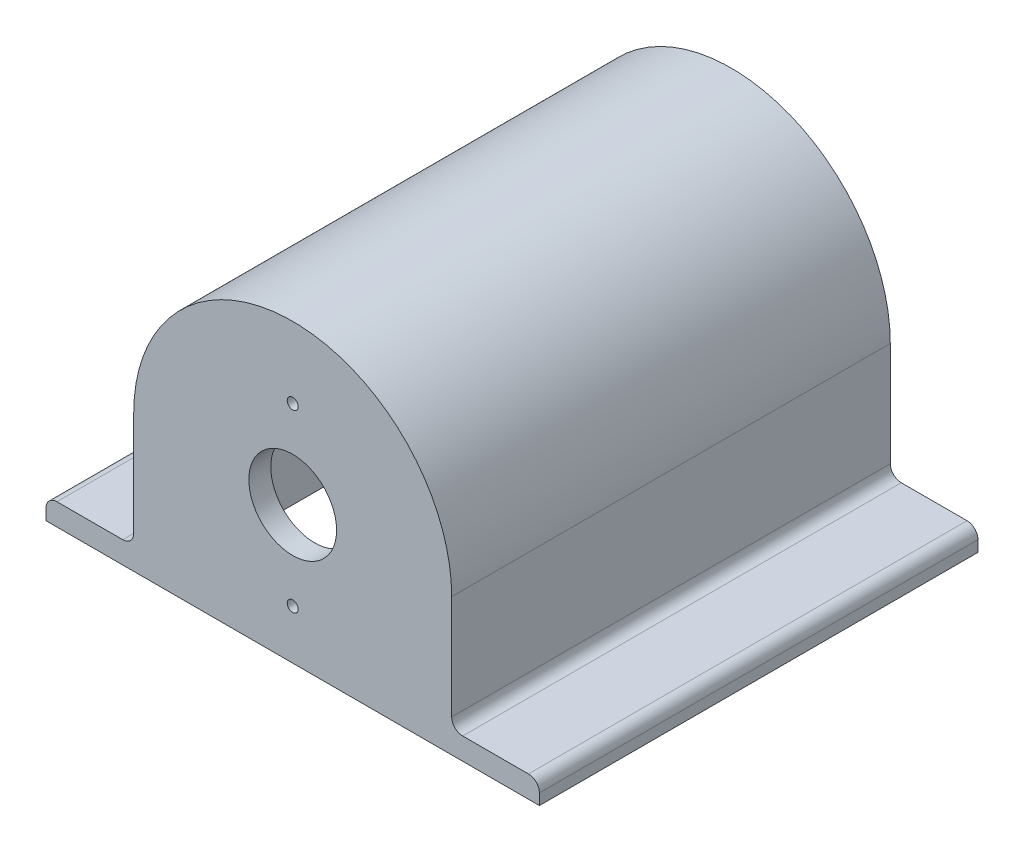
ISO-10303-21;
HEADER;
FILE_DESCRIPTION(('STEP AP214'),'2;1');
FILE_NAME('part.step','',(''),(''),'','','');
FILE_SCHEMA(('AUTOMOTIVE_DESIGN { 1 0 10303 214 1 1 1 1 }'));
ENDSEC;
DATA;
#1=APPLICATION_CONTEXT('core data for automotive mechanical design processes');
#2=APPLICATION_PROTOCOL_DEFINITION('international standard','automotive_design',2000,#1);
#3=PRODUCT_CONTEXT('',#1,'mechanical');
#4=PRODUCT('Part','Part','',(#3));
#5=PRODUCT_RELATED_PRODUCT_CATEGORY('part','',(#4));
#6=PRODUCT_DEFINITION_FORMATION('','',#4);
#7=PRODUCT_DEFINITION_CONTEXT('part definition',#1,'design');
#8=PRODUCT_DEFINITION('design','',#6,#7);
#9=PRODUCT_DEFINITION_SHAPE('','',#8);
#10=(LENGTH_UNIT() NAMED_UNIT(*) SI_UNIT(.MILLI.,.METRE.));
#11=(NAMED_UNIT(*) PLANE_ANGLE_UNIT() SI_UNIT($,.RADIAN.));
#12=(NAMED_UNIT(*) SI_UNIT($,.STERADIAN.) SOLID_ANGLE_UNIT());
#13=UNCERTAINTY_MEASURE_WITH_UNIT(LENGTH_MEASURE(1.E-05),#10,'distance_accuracy_value','');
#14=(GEOMETRIC_REPRESENTATION_CONTEXT(3) GLOBAL_UNCERTAINTY_ASSIGNED_CONTEXT((#13)) GLOBAL_UNIT_ASSIGNED_CONTEXT((#10,
#11,#12)) REPRESENTATION_CONTEXT('',''));
#15=CARTESIAN_POINT('',(0.,0.,0.));
#16=DIRECTION('',(0.,0.,1.));
#17=DIRECTION('',(1.,0.,0.));
#18=AXIS2_PLACEMENT_3D('',#15,#16,#17);
#19=CARTESIAN_POINT('',(0.,0.,40.));
#20=DIRECTION('',(0.,0.,-1.));
#21=DIRECTION('',(-1.,0.,0.));
#22=AXIS2_PLACEMENT_3D('',#19,#20,#21);
#23=CYLINDRICAL_SURFACE('',#22,12.5);
#24=DIRECTION('',(0.,0.,-1.));
#25=VECTOR('',#24,1.);
#26=CARTESIAN_POINT('',(12.5,0.,40.));
#27=LINE('',#26,#25);
#28=CARTESIAN_POINT('',(12.5,0.,38.));
#29=VERTEX_POINT('',#28);
#30=CARTESIAN_POINT('',(12.5,0.,0.));
#31=VERTEX_POINT('',#30);
#32=EDGE_CURVE('E177',#29,#31,#27,.T.);
#33=ORIENTED_EDGE('',*,*,#32,.F.);
#34=CARTESIAN_POINT('',(0.,0.,38.));
#35=DIRECTION('',(0.,0.,1.));
#36=DIRECTION('',(1.,0.,0.));
#37=AXIS2_PLACEMENT_3D('',#34,#35,#36);
#38=CIRCLE('',#37,12.5);
#39=CARTESIAN_POINT('',(-12.5,0.,38.));
#40=VERTEX_POINT('',#39);
#41=EDGE_CURVE('E163',#40,#29,#38,.F.);
#42=ORIENTED_EDGE('',*,*,#41,.F.);
#43=DIRECTION('',(0.,0.,-1.));
#44=VECTOR('',#43,1.);
#45=CARTESIAN_POINT('',(-12.5,0.,40.));
#46=LINE('',#45,#44);
#47=CARTESIAN_POINT('',(-12.5,0.,0.));
#48=VERTEX_POINT('',#47);
#49=EDGE_CURVE('E175',#40,#48,#46,.T.);
#50=ORIENTED_EDGE('',*,*,#49,.T.);
#51=CARTESIAN_POINT('',(0.,0.,0.));
#52=DIRECTION('',(0.,0.,1.));
#53=DIRECTION('',(1.,0.,0.));
#54=AXIS2_PLACEMENT_3D('',#51,#52,#53);
#55=CIRCLE('',#54,12.5);
#56=EDGE_CURVE('E348',#31,#48,#55,.T.);
#57=ORIENTED_EDGE('',*,*,#56,.F.);
#58=EDGE_LOOP('',(#33,#42,#50,#57));
#59=FACE_BOUND('',#58,.T.);
#60=ADVANCED_FACE('F42',(#59),#23,.F.);
#61=CARTESIAN_POINT('',(-12.5,-12.5,40.));
#62=DIRECTION('',(-1.,0.,0.));
#63=DIRECTION('',(0.,0.,1.));
#64=AXIS2_PLACEMENT_3D('',#61,#62,#63);
#65=PLANE('',#64);
#66=DIRECTION('',(0.,1.,0.));
#67=VECTOR('',#66,1.);
#68=CARTESIAN_POINT('',(-12.5,0.,38.));
#69=LINE('',#68,#67);
#70=CARTESIAN_POINT('',(-12.5,-12.5,38.));
#71=VERTEX_POINT('',#70);
#72=EDGE_CURVE('E158',#71,#40,#69,.T.);
#73=ORIENTED_EDGE('',*,*,#72,.F.);
#74=DIRECTION('',(0.,0.,1.));
#75=VECTOR('',#74,1.);
#76=CARTESIAN_POINT('',(-12.5,-12.5,40.));
#77=LINE('',#76,#75);
#78=CARTESIAN_POINT('',(-12.5,-12.5,0.));
#79=VERTEX_POINT('',#78);
#80=EDGE_CURVE('E329',#79,#71,#77,.T.);
#81=ORIENTED_EDGE('',*,*,#80,.F.);
#82=DIRECTION('',(0.,1.,0.));
#83=VECTOR('',#82,1.);
#84=CARTESIAN_POINT('',(-12.5,-12.5,0.));
#85=LINE('',#84,#83);
#86=EDGE_CURVE('E183',#79,#48,#85,.T.);
#87=ORIENTED_EDGE('',*,*,#86,.T.);
#88=ORIENTED_EDGE('',*,*,#49,.F.);
#89=EDGE_LOOP('',(#73,#81,#87,#88));
#90=FACE_BOUND('',#89,.T.);
#91=ADVANCED_FACE('F181',(#90),#65,.F.);
#92=CARTESIAN_POINT('',(12.5,-12.5,0.));
#93=DIRECTION('',(1.,0.,0.));
#94=DIRECTION('',(0.,0.,-1.));
#95=AXIS2_PLACEMENT_3D('',#92,#93,#94);
#96=PLANE('',#95);
#97=DIRECTION('',(0.,-1.,0.));
#98=VECTOR('',#97,1.);
#99=CARTESIAN_POINT('',(12.5,0.,38.));
#100=LINE('',#99,#98);
#101=CARTESIAN_POINT('',(12.5,-12.5,38.));
#102=VERTEX_POINT('',#101);
#103=EDGE_CURVE('E263',#29,#102,#100,.T.);
#104=ORIENTED_EDGE('',*,*,#103,.F.);
#105=ORIENTED_EDGE('',*,*,#32,.T.);
#106=DIRECTION('',(0.,1.,0.));
#107=VECTOR('',#106,1.);
#108=CARTESIAN_POINT('',(12.5,-12.5,0.));
#109=LINE('',#108,#107);
#110=CARTESIAN_POINT('',(12.5,-12.5,0.));
#111=VERTEX_POINT('',#110);
#112=EDGE_CURVE('E319',#111,#31,#109,.T.);
#113=ORIENTED_EDGE('',*,*,#112,.F.);
#114=DIRECTION('',(0.,0.,-1.));
#115=VECTOR('',#114,1.);
#116=CARTESIAN_POINT('',(12.5,-12.5,0.));
#117=LINE('',#116,#115);
#118=EDGE_CURVE('E307',#102,#111,#117,.T.);
#119=ORIENTED_EDGE('',*,*,#118,.F.);
#120=EDGE_LOOP('',(#104,#105,#113,#119));
#121=FACE_BOUND('',#120,.T.);
#122=ADVANCED_FACE('F360',(#121),#96,.F.);
#123=CARTESIAN_POINT('',(14.5,-12.5,0.));
#124=DIRECTION('',(-1.,0.,0.));
#125=DIRECTION('',(0.,0.,1.));
#126=AXIS2_PLACEMENT_3D('',#123,#124,#125);
#127=PLANE('',#126);
#128=DIRECTION('',(0.,1.,0.));
#129=VECTOR('',#128,1.);
#130=CARTESIAN_POINT('',(14.5,-12.5,40.));
#131=LINE('',#130,#129);
#132=CARTESIAN_POINT('',(14.5,-9.5,40.));
#133=VERTEX_POINT('',#132);
#134=CARTESIAN_POINT('',(14.5,0.,40.));
#135=VERTEX_POINT('',#134);
#136=EDGE_CURVE('E323',#133,#135,#131,.T.);
#137=ORIENTED_EDGE('',*,*,#136,.F.);
#138=DIRECTION('',(0.,0.,1.));
#139=VECTOR('',#138,1.);
#140=CARTESIAN_POINT('',(14.5,-9.5,0.));
#141=LINE('',#140,#139);
#142=CARTESIAN_POINT('',(14.5,-9.5,0.));
#143=VERTEX_POINT('',#142);
#144=EDGE_CURVE('E234',#133,#143,#141,.F.);
#145=ORIENTED_EDGE('',*,*,#144,.T.);
#146=DIRECTION('',(0.,1.,0.));
#147=VECTOR('',#146,1.);
#148=CARTESIAN_POINT('',(14.5,-12.5,0.));
#149=LINE('',#148,#147);
#150=CARTESIAN_POINT('',(14.5,0.,0.));
#151=VERTEX_POINT('',#150);
#152=EDGE_CURVE('E316',#143,#151,#149,.T.);
#153=ORIENTED_EDGE('',*,*,#152,.T.);
#154=DIRECTION('',(0.,0.,-1.));
#155=VECTOR('',#154,1.);
#156=CARTESIAN_POINT('',(14.5,0.,40.));
#157=LINE('',#156,#155);
#158=EDGE_CURVE('E191',#135,#151,#157,.T.);
#159=ORIENTED_EDGE('',*,*,#158,.F.);
#160=EDGE_LOOP('',(#137,#145,#153,#159));
#161=FACE_BOUND('',#160,.T.);
#162=ADVANCED_FACE('F395',(#161),#127,.F.);
#163=CARTESIAN_POINT('',(0.,0.,40.));
#164=DIRECTION('',(0.,0.,-1.));
#165=DIRECTION('',(-1.,0.,0.));
#166=AXIS2_PLACEMENT_3D('',#163,#164,#165);
#167=CYLINDRICAL_SURFACE('',#166,14.5);
#168=CARTESIAN_POINT('',(0.,0.,0.));
#169=DIRECTION('',(0.,0.,1.));
#170=DIRECTION('',(1.,0.,0.));
#171=AXIS2_PLACEMENT_3D('',#168,#169,#170);
#172=CIRCLE('',#171,14.5);
#173=CARTESIAN_POINT('',(-14.5,0.,0.));
#174=VERTEX_POINT('',#173);
#175=EDGE_CURVE('E344',#151,#174,#172,.T.);
#176=ORIENTED_EDGE('',*,*,#175,.T.);
#177=DIRECTION('',(0.,0.,-1.));
#178=VECTOR('',#177,1.);
#179=CARTESIAN_POINT('',(-14.5,0.,40.));
#180=LINE('',#179,#178);
#181=CARTESIAN_POINT('',(-14.5,0.,40.));
#182=VERTEX_POINT('',#181);
#183=EDGE_CURVE('E186',#182,#174,#180,.T.);
#184=ORIENTED_EDGE('',*,*,#183,.F.);
#185=CARTESIAN_POINT('',(0.,0.,40.));
#186=DIRECTION('',(0.,0.,1.));
#187=DIRECTION('',(1.,0.,0.));
#188=AXIS2_PLACEMENT_3D('',#185,#186,#187);
#189=CIRCLE('',#188,14.5);
#190=EDGE_CURVE('E193',#135,#182,#189,.T.);
#191=ORIENTED_EDGE('',*,*,#190,.F.);
#192=ORIENTED_EDGE('',*,*,#158,.T.);
#193=EDGE_LOOP('',(#176,#184,#191,#192));
#194=FACE_BOUND('',#193,.T.);
#195=ADVANCED_FACE('F391',(#194),#167,.T.);
#196=CARTESIAN_POINT('',(0.,0.,40.));
#197=DIRECTION('',(0.,0.,1.));
#198=DIRECTION('',(1.,0.,0.));
#199=AXIS2_PLACEMENT_3D('',#196,#197,#198);
#200=PLANE('',#199);
#201=CARTESIAN_POINT('',(0.,8.,40.));
#202=DIRECTION('',(0.,0.,1.));
#203=DIRECTION('',(1.,0.,0.));
#204=AXIS2_PLACEMENT_3D('',#201,#202,#203);
#205=CIRCLE('',#204,0.5);
#206=CARTESIAN_POINT('',(0.5,8.,40.));
#207=VERTEX_POINT('',#206);
#208=EDGE_CURVE('E246',#207,#207,#205,.T.);
#209=ORIENTED_EDGE('',*,*,#208,.F.);
#210=EDGE_LOOP('',(#209));
#211=FACE_BOUND('',#210,.T.);
#212=CARTESIAN_POINT('',(0.,-8.,40.));
#213=DIRECTION('',(0.,0.,1.));
#214=DIRECTION('',(1.,0.,0.));
#215=AXIS2_PLACEMENT_3D('',#212,#213,#214);
#216=CIRCLE('',#215,0.5);
#217=CARTESIAN_POINT('',(0.5,-8.,40.));
#218=VERTEX_POINT('',#217);
#219=EDGE_CURVE('E253',#218,#218,#216,.T.);
#220=ORIENTED_EDGE('',*,*,#219,.F.);
#221=EDGE_LOOP('',(#220));
#222=FACE_BOUND('',#221,.T.);
#223=DIRECTION('',(-1.,0.,0.));
#224=VECTOR('',#223,1.);
#225=CARTESIAN_POINT('',(-12.5,-10.5,40.));
#226=LINE('',#225,#224);
#227=CARTESIAN_POINT('',(-15.5,-10.5,40.));
#228=VERTEX_POINT('',#227);
#229=CARTESIAN_POINT('',(-21.5,-10.5,40.));
#230=VERTEX_POINT('',#229);
#231=EDGE_CURVE('E292',#228,#230,#226,.T.);
#232=ORIENTED_EDGE('',*,*,#231,.T.);
#233=CARTESIAN_POINT('',(-21.5,-11.5,40.));
#234=DIRECTION('',(0.,0.,1.));
#235=DIRECTION('',(1.,0.,0.));
#236=AXIS2_PLACEMENT_3D('',#233,#234,#235);
#237=CIRCLE('',#236,1.);
#238=CARTESIAN_POINT('',(-22.5,-11.5,40.));
#239=VERTEX_POINT('',#238);
#240=EDGE_CURVE('E218',#230,#239,#237,.T.);
#241=ORIENTED_EDGE('',*,*,#240,.T.);
#242=DIRECTION('',(0.,-1.,0.));
#243=VECTOR('',#242,1.);
#244=CARTESIAN_POINT('',(-22.5,-10.5,40.));
#245=LINE('',#244,#243);
#246=CARTESIAN_POINT('',(-22.5,-12.5,40.));
#247=VERTEX_POINT('',#246);
#248=EDGE_CURVE('E300',#239,#247,#245,.T.);
#249=ORIENTED_EDGE('',*,*,#248,.T.);
#250=DIRECTION('',(-1.,0.,0.));
#251=VECTOR('',#250,1.);
#252=CARTESIAN_POINT('',(-14.5,-12.5,40.));
#253=LINE('',#252,#251);
#254=CARTESIAN_POINT('',(22.5,-12.5,40.));
#255=VERTEX_POINT('',#254);
#256=EDGE_CURVE('E332',#255,#247,#253,.T.);
#257=ORIENTED_EDGE('',*,*,#256,.F.);
#258=DIRECTION('',(0.,-1.,0.));
#259=VECTOR('',#258,1.);
#260=CARTESIAN_POINT('',(22.5,-10.5,40.));
#261=LINE('',#260,#259);
#262=CARTESIAN_POINT('',(22.5,-11.5,40.));
#263=VERTEX_POINT('',#262);
#264=EDGE_CURVE('E286',#263,#255,#261,.T.);
#265=ORIENTED_EDGE('',*,*,#264,.F.);
#266=CARTESIAN_POINT('',(21.5,-11.5,40.));
#267=DIRECTION('',(0.,0.,1.));
#268=DIRECTION('',(1.,0.,0.));
#269=AXIS2_PLACEMENT_3D('',#266,#267,#268);
#270=CIRCLE('',#269,1.);
#271=CARTESIAN_POINT('',(21.5,-10.5,40.));
#272=VERTEX_POINT('',#271);
#273=EDGE_CURVE('E60',#263,#272,#270,.T.);
#274=ORIENTED_EDGE('',*,*,#273,.T.);
#275=DIRECTION('',(-1.,0.,0.));
#276=VECTOR('',#275,1.);
#277=CARTESIAN_POINT('',(12.5,-10.5,40.));
#278=LINE('',#277,#276);
#279=CARTESIAN_POINT('',(15.5,-10.5,40.));
#280=VERTEX_POINT('',#279);
#281=EDGE_CURVE('E278',#272,#280,#278,.T.);
#282=ORIENTED_EDGE('',*,*,#281,.T.);
#283=CARTESIAN_POINT('',(15.5,-9.5,40.));
#284=DIRECTION('',(0.,0.,1.));
#285=DIRECTION('',(1.,0.,0.));
#286=AXIS2_PLACEMENT_3D('',#283,#284,#285);
#287=CIRCLE('',#286,1.);
#288=EDGE_CURVE('E52',#280,#133,#287,.F.);
#289=ORIENTED_EDGE('',*,*,#288,.T.);
#290=ORIENTED_EDGE('',*,*,#136,.T.);
#291=ORIENTED_EDGE('',*,*,#190,.T.);
#292=DIRECTION('',(0.,1.,0.));
#293=VECTOR('',#292,1.);
#294=CARTESIAN_POINT('',(-14.5,-12.5,40.));
#295=LINE('',#294,#293);
#296=CARTESIAN_POINT('',(-14.5,-9.5,40.));
#297=VERTEX_POINT('',#296);
#298=EDGE_CURVE('E336',#297,#182,#295,.T.);
#299=ORIENTED_EDGE('',*,*,#298,.F.);
#300=CARTESIAN_POINT('',(-15.5,-9.5,40.));
#301=DIRECTION('',(0.,0.,1.));
#302=DIRECTION('',(1.,0.,0.));
#303=AXIS2_PLACEMENT_3D('',#300,#301,#302);
#304=CIRCLE('',#303,1.);
#305=EDGE_CURVE('E68',#297,#228,#304,.F.);
#306=ORIENTED_EDGE('',*,*,#305,.T.);
#307=EDGE_LOOP('',(#232,#241,#249,#257,#265,#274,#282,#289,#290,#291,#299,#306));
#308=FACE_BOUND('',#307,.T.);
#309=CARTESIAN_POINT('',(0.,0.,40.));
#310=DIRECTION('',(0.,0.,1.));
#311=DIRECTION('',(1.,0.,0.));
#312=AXIS2_PLACEMENT_3D('',#309,#310,#311);
#313=CIRCLE('',#312,4.);
#314=CARTESIAN_POINT('',(4.,0.,40.));
#315=VERTEX_POINT('',#314);
#316=EDGE_CURVE('E179',#315,#315,#313,.T.);
#317=ORIENTED_EDGE('',*,*,#316,.F.);
#318=EDGE_LOOP('',(#317));
#319=FACE_BOUND('',#318,.T.);
#320=ADVANCED_FACE('F378',(#211,#222,#308,#319),#200,.T.);
#321=CARTESIAN_POINT('',(0.,0.,0.));
#322=DIRECTION('',(0.,0.,1.));
#323=DIRECTION('',(1.,0.,0.));
#324=AXIS2_PLACEMENT_3D('',#321,#322,#323);
#325=PLANE('',#324);
#326=DIRECTION('',(0.,-1.,0.));
#327=VECTOR('',#326,1.);
#328=CARTESIAN_POINT('',(-22.5,-10.5,0.));
#329=LINE('',#328,#327);
#330=CARTESIAN_POINT('',(-22.5,-11.5,0.));
#331=VERTEX_POINT('',#330);
#332=CARTESIAN_POINT('',(-22.5,-12.5,0.));
#333=VERTEX_POINT('',#332);
#334=EDGE_CURVE('E304',#331,#333,#329,.T.);
#335=ORIENTED_EDGE('',*,*,#334,.F.);
#336=CARTESIAN_POINT('',(-21.5,-11.5,0.));
#337=DIRECTION('',(0.,0.,1.));
#338=DIRECTION('',(1.,0.,0.));
#339=AXIS2_PLACEMENT_3D('',#336,#337,#338);
#340=CIRCLE('',#339,1.);
#341=CARTESIAN_POINT('',(-21.5,-10.5,0.));
#342=VERTEX_POINT('',#341);
#343=EDGE_CURVE('E207',#331,#342,#340,.F.);
#344=ORIENTED_EDGE('',*,*,#343,.T.);
#345=DIRECTION('',(1.,0.,0.));
#346=VECTOR('',#345,1.);
#347=CARTESIAN_POINT('',(-12.5,-10.5,0.));
#348=LINE('',#347,#346);
#349=CARTESIAN_POINT('',(-15.5,-10.5,0.));
#350=VERTEX_POINT('',#349);
#351=EDGE_CURVE('E296',#342,#350,#348,.T.);
#352=ORIENTED_EDGE('',*,*,#351,.T.);
#353=CARTESIAN_POINT('',(-15.5,-9.5,0.));
#354=DIRECTION('',(0.,0.,1.));
#355=DIRECTION('',(1.,0.,0.));
#356=AXIS2_PLACEMENT_3D('',#353,#354,#355);
#357=CIRCLE('',#356,1.);
#358=CARTESIAN_POINT('',(-14.5,-9.5,0.));
#359=VERTEX_POINT('',#358);
#360=EDGE_CURVE('E239',#350,#359,#357,.T.);
#361=ORIENTED_EDGE('',*,*,#360,.T.);
#362=DIRECTION('',(0.,1.,0.));
#363=VECTOR('',#362,1.);
#364=CARTESIAN_POINT('',(-14.5,-12.5,0.));
#365=LINE('',#364,#363);
#366=EDGE_CURVE('E341',#359,#174,#365,.T.);
#367=ORIENTED_EDGE('',*,*,#366,.T.);
#368=ORIENTED_EDGE('',*,*,#175,.F.);
#369=ORIENTED_EDGE('',*,*,#152,.F.);
#370=CARTESIAN_POINT('',(15.5,-9.5,0.));
#371=DIRECTION('',(0.,0.,1.));
#372=DIRECTION('',(1.,0.,0.));
#373=AXIS2_PLACEMENT_3D('',#370,#371,#372);
#374=CIRCLE('',#373,1.);
#375=CARTESIAN_POINT('',(15.5,-10.5,0.));
#376=VERTEX_POINT('',#375);
#377=EDGE_CURVE('E11',#143,#376,#374,.T.);
#378=ORIENTED_EDGE('',*,*,#377,.T.);
#379=DIRECTION('',(1.,0.,0.));
#380=VECTOR('',#379,1.);
#381=CARTESIAN_POINT('',(12.5,-10.5,0.));
#382=LINE('',#381,#380);
#383=CARTESIAN_POINT('',(21.5,-10.5,0.));
#384=VERTEX_POINT('',#383);
#385=EDGE_CURVE('E274',#376,#384,#382,.T.);
#386=ORIENTED_EDGE('',*,*,#385,.T.);
#387=CARTESIAN_POINT('',(21.5,-11.5,0.));
#388=DIRECTION('',(0.,0.,1.));
#389=DIRECTION('',(1.,0.,0.));
#390=AXIS2_PLACEMENT_3D('',#387,#388,#389);
#391=CIRCLE('',#390,1.);
#392=CARTESIAN_POINT('',(22.5,-11.5,0.));
#393=VERTEX_POINT('',#392);
#394=EDGE_CURVE('E204',#384,#393,#391,.F.);
#395=ORIENTED_EDGE('',*,*,#394,.T.);
#396=DIRECTION('',(0.,-1.,0.));
#397=VECTOR('',#396,1.);
#398=CARTESIAN_POINT('',(22.5,-10.5,0.));
#399=LINE('',#398,#397);
#400=CARTESIAN_POINT('',(22.5,-12.5,0.));
#401=VERTEX_POINT('',#400);
#402=EDGE_CURVE('E282',#393,#401,#399,.T.);
#403=ORIENTED_EDGE('',*,*,#402,.T.);
#404=DIRECTION('',(1.,0.,0.));
#405=VECTOR('',#404,1.);
#406=CARTESIAN_POINT('',(14.5,-12.5,0.));
#407=LINE('',#406,#405);
#408=EDGE_CURVE('E312',#111,#401,#407,.T.);
#409=ORIENTED_EDGE('',*,*,#408,.F.);
#410=ORIENTED_EDGE('',*,*,#112,.T.);
#411=ORIENTED_EDGE('',*,*,#56,.T.);
#412=ORIENTED_EDGE('',*,*,#86,.F.);
#413=DIRECTION('',(1.,0.,0.));
#414=VECTOR('',#413,1.);
#415=CARTESIAN_POINT('',(-14.5,-12.5,0.));
#416=LINE('',#415,#414);
#417=EDGE_CURVE('E326',#333,#79,#416,.T.);
#418=ORIENTED_EDGE('',*,*,#417,.F.);
#419=EDGE_LOOP('',(#335,#344,#352,#361,#367,#368,#369,#378,#386,#395,#403,#409,#410,#411,#412,#418));
#420=FACE_BOUND('',#419,.T.);
#421=ADVANCED_FACE('F354',(#420),#325,.F.);
#422=CARTESIAN_POINT('',(-14.5,-12.5,40.));
#423=DIRECTION('',(1.,0.,0.));
#424=DIRECTION('',(0.,0.,-1.));
#425=AXIS2_PLACEMENT_3D('',#422,#423,#424);
#426=PLANE('',#425);
#427=ORIENTED_EDGE('',*,*,#366,.F.);
#428=DIRECTION('',(0.,0.,1.));
#429=VECTOR('',#428,1.);
#430=CARTESIAN_POINT('',(-14.5,-9.5,40.));
#431=LINE('',#430,#429);
#432=EDGE_CURVE('E221',#359,#297,#431,.T.);
#433=ORIENTED_EDGE('',*,*,#432,.T.);
#434=ORIENTED_EDGE('',*,*,#298,.T.);
#435=ORIENTED_EDGE('',*,*,#183,.T.);
#436=EDGE_LOOP('',(#427,#433,#434,#435));
#437=FACE_BOUND('',#436,.T.);
#438=ADVANCED_FACE('F385',(#437),#426,.F.);
#439=CARTESIAN_POINT('',(0.,-12.5,0.));
#440=DIRECTION('',(0.,-1.,0.));
#441=DIRECTION('',(0.,0.,-1.));
#442=AXIS2_PLACEMENT_3D('',#439,#440,#441);
#443=PLANE('',#442);
#444=ORIENTED_EDGE('',*,*,#256,.T.);
#445=DIRECTION('',(0.,0.,-1.));
#446=VECTOR('',#445,1.);
#447=CARTESIAN_POINT('',(-22.5,-12.5,40.));
#448=LINE('',#447,#446);
#449=EDGE_CURVE('E289',#247,#333,#448,.T.);
#450=ORIENTED_EDGE('',*,*,#449,.T.);
#451=ORIENTED_EDGE('',*,*,#417,.T.);
#452=ORIENTED_EDGE('',*,*,#80,.T.);
#453=DIRECTION('',(1.,0.,0.));
#454=VECTOR('',#453,1.);
#455=CARTESIAN_POINT('',(0.,-12.5,38.));
#456=LINE('',#455,#454);
#457=EDGE_CURVE('E165',#71,#102,#456,.T.);
#458=ORIENTED_EDGE('',*,*,#457,.T.);
#459=ORIENTED_EDGE('',*,*,#118,.T.);
#460=ORIENTED_EDGE('',*,*,#408,.T.);
#461=DIRECTION('',(0.,0.,1.));
#462=VECTOR('',#461,1.);
#463=CARTESIAN_POINT('',(22.5,-12.5,40.));
#464=LINE('',#463,#462);
#465=EDGE_CURVE('E270',#401,#255,#464,.T.);
#466=ORIENTED_EDGE('',*,*,#465,.T.);
#467=EDGE_LOOP('',(#444,#450,#451,#452,#458,#459,#460,#466));
#468=FACE_BOUND('',#467,.T.);
#469=ADVANCED_FACE('F362',(#468),#443,.T.);
#470=CARTESIAN_POINT('',(0.,-10.5,0.));
#471=DIRECTION('',(0.,1.,0.));
#472=DIRECTION('',(0.,0.,1.));
#473=AXIS2_PLACEMENT_3D('',#470,#471,#472);
#474=PLANE('',#473);
#475=ORIENTED_EDGE('',*,*,#351,.F.);
#476=DIRECTION('',(0.,0.,-1.));
#477=VECTOR('',#476,1.);
#478=CARTESIAN_POINT('',(-21.5,-10.5,0.));
#479=LINE('',#478,#477);
#480=EDGE_CURVE('E213',#342,#230,#479,.F.);
#481=ORIENTED_EDGE('',*,*,#480,.T.);
#482=ORIENTED_EDGE('',*,*,#231,.F.);
#483=DIRECTION('',(0.,0.,1.));
#484=VECTOR('',#483,1.);
#485=CARTESIAN_POINT('',(-15.5,-10.5,0.));
#486=LINE('',#485,#484);
#487=EDGE_CURVE('E210',#228,#350,#486,.F.);
#488=ORIENTED_EDGE('',*,*,#487,.T.);
#489=EDGE_LOOP('',(#475,#481,#482,#488));
#490=FACE_BOUND('',#489,.T.);
#491=ADVANCED_FACE('F376',(#490),#474,.T.);
#492=CARTESIAN_POINT('',(-22.5,-10.5,40.));
#493=DIRECTION('',(-1.,0.,0.));
#494=DIRECTION('',(0.,0.,1.));
#495=AXIS2_PLACEMENT_3D('',#492,#493,#494);
#496=PLANE('',#495);
#497=ORIENTED_EDGE('',*,*,#248,.F.);
#498=DIRECTION('',(0.,0.,-1.));
#499=VECTOR('',#498,1.);
#500=CARTESIAN_POINT('',(-22.5,-11.5,40.));
#501=LINE('',#500,#499);
#502=EDGE_CURVE('E200',#239,#331,#501,.T.);
#503=ORIENTED_EDGE('',*,*,#502,.T.);
#504=ORIENTED_EDGE('',*,*,#334,.T.);
#505=ORIENTED_EDGE('',*,*,#449,.F.);
#506=EDGE_LOOP('',(#497,#503,#504,#505));
#507=FACE_BOUND('',#506,.T.);
#508=ADVANCED_FACE('F368',(#507),#496,.T.);
#509=CARTESIAN_POINT('',(0.,-10.5,0.));
#510=DIRECTION('',(0.,-1.,0.));
#511=DIRECTION('',(0.,0.,-1.));
#512=AXIS2_PLACEMENT_3D('',#509,#510,#511);
#513=PLANE('',#512);
#514=ORIENTED_EDGE('',*,*,#281,.F.);
#515=DIRECTION('',(0.,0.,1.));
#516=VECTOR('',#515,1.);
#517=CARTESIAN_POINT('',(21.5,-10.5,0.));
#518=LINE('',#517,#516);
#519=EDGE_CURVE('E231',#272,#384,#518,.F.);
#520=ORIENTED_EDGE('',*,*,#519,.T.);
#521=ORIENTED_EDGE('',*,*,#385,.F.);
#522=DIRECTION('',(0.,0.,1.));
#523=VECTOR('',#522,1.);
#524=CARTESIAN_POINT('',(15.5,-10.5,40.));
#525=LINE('',#524,#523);
#526=EDGE_CURVE('E227',#376,#280,#525,.T.);
#527=ORIENTED_EDGE('',*,*,#526,.T.);
#528=EDGE_LOOP('',(#514,#520,#521,#527));
#529=FACE_BOUND('',#528,.T.);
#530=ADVANCED_FACE('F403',(#529),#513,.F.);
#531=CARTESIAN_POINT('',(22.5,-10.5,40.));
#532=DIRECTION('',(1.,0.,0.));
#533=DIRECTION('',(0.,0.,-1.));
#534=AXIS2_PLACEMENT_3D('',#531,#532,#533);
#535=PLANE('',#534);
#536=ORIENTED_EDGE('',*,*,#402,.F.);
#537=DIRECTION('',(0.,0.,1.));
#538=VECTOR('',#537,1.);
#539=CARTESIAN_POINT('',(22.5,-11.5,40.));
#540=LINE('',#539,#538);
#541=EDGE_CURVE('E224',#393,#263,#540,.T.);
#542=ORIENTED_EDGE('',*,*,#541,.T.);
#543=ORIENTED_EDGE('',*,*,#264,.T.);
#544=ORIENTED_EDGE('',*,*,#465,.F.);
#545=EDGE_LOOP('',(#536,#542,#543,#544));
#546=FACE_BOUND('',#545,.T.);
#547=ADVANCED_FACE('F408',(#546),#535,.T.);
#548=CARTESIAN_POINT('',(0.,0.,38.));
#549=DIRECTION('',(0.,0.,1.));
#550=DIRECTION('',(1.,0.,0.));
#551=AXIS2_PLACEMENT_3D('',#548,#549,#550);
#552=CYLINDRICAL_SURFACE('',#551,4.);
#553=CARTESIAN_POINT('',(0.,0.,38.));
#554=DIRECTION('',(0.,0.,1.));
#555=DIRECTION('',(1.,0.,0.));
#556=AXIS2_PLACEMENT_3D('',#553,#554,#555);
#557=CIRCLE('',#556,4.);
#558=CARTESIAN_POINT('',(4.,0.,38.));
#559=VERTEX_POINT('',#558);
#560=EDGE_CURVE('E266',#559,#559,#557,.T.);
#561=ORIENTED_EDGE('',*,*,#560,.F.);
#562=EDGE_LOOP('',(#561));
#563=FACE_BOUND('',#562,.T.);
#564=ORIENTED_EDGE('',*,*,#316,.T.);
#565=EDGE_LOOP('',(#564));
#566=FACE_BOUND('',#565,.T.);
#567=ADVANCED_FACE('F434',(#563,#566),#552,.F.);
#568=CARTESIAN_POINT('',(0.,0.,38.));
#569=DIRECTION('',(0.,0.,1.));
#570=DIRECTION('',(1.,0.,0.));
#571=AXIS2_PLACEMENT_3D('',#568,#569,#570);
#572=PLANE('',#571);
#573=CARTESIAN_POINT('',(0.,8.,38.));
#574=DIRECTION('',(0.,0.,1.));
#575=DIRECTION('',(1.,0.,0.));
#576=AXIS2_PLACEMENT_3D('',#573,#574,#575);
#577=CIRCLE('',#576,0.5);
#578=CARTESIAN_POINT('',(0.5,8.,38.));
#579=VERTEX_POINT('',#578);
#580=EDGE_CURVE('E46',#579,#579,#577,.T.);
#581=ORIENTED_EDGE('',*,*,#580,.T.);
#582=EDGE_LOOP('',(#581));
#583=FACE_BOUND('',#582,.T.);
#584=CARTESIAN_POINT('',(0.,-8.,38.));
#585=DIRECTION('',(0.,0.,1.));
#586=DIRECTION('',(1.,0.,0.));
#587=AXIS2_PLACEMENT_3D('',#584,#585,#586);
#588=CIRCLE('',#587,0.5);
#589=CARTESIAN_POINT('',(0.5,-8.,38.));
#590=VERTEX_POINT('',#589);
#591=EDGE_CURVE('E243',#590,#590,#588,.T.);
#592=ORIENTED_EDGE('',*,*,#591,.T.);
#593=EDGE_LOOP('',(#592));
#594=FACE_BOUND('',#593,.T.);
#595=ORIENTED_EDGE('',*,*,#41,.T.);
#596=ORIENTED_EDGE('',*,*,#103,.T.);
#597=ORIENTED_EDGE('',*,*,#457,.F.);
#598=ORIENTED_EDGE('',*,*,#72,.T.);
#599=EDGE_LOOP('',(#595,#596,#597,#598));
#600=FACE_BOUND('',#599,.T.);
#601=ORIENTED_EDGE('',*,*,#560,.T.);
#602=EDGE_LOOP('',(#601));
#603=FACE_BOUND('',#602,.T.);
#604=ADVANCED_FACE('F160',(#583,#594,#600,#603),#572,.F.);
#605=CARTESIAN_POINT('',(-21.5,-11.5,40.));
#606=DIRECTION('',(0.,0.,-1.));
#607=DIRECTION('',(-1.,0.,0.));
#608=AXIS2_PLACEMENT_3D('',#605,#606,#607);
#609=CYLINDRICAL_SURFACE('',#608,1.);
#610=ORIENTED_EDGE('',*,*,#240,.F.);
#611=ORIENTED_EDGE('',*,*,#480,.F.);
#612=ORIENTED_EDGE('',*,*,#343,.F.);
#613=ORIENTED_EDGE('',*,*,#502,.F.);
#614=EDGE_LOOP('',(#610,#611,#612,#613));
#615=FACE_BOUND('',#614,.T.);
#616=ADVANCED_FACE('F372',(#615),#609,.T.);
#617=CARTESIAN_POINT('',(-15.5,-9.5,40.));
#618=DIRECTION('',(0.,0.,1.));
#619=DIRECTION('',(1.,0.,0.));
#620=AXIS2_PLACEMENT_3D('',#617,#618,#619);
#621=CYLINDRICAL_SURFACE('',#620,1.);
#622=ORIENTED_EDGE('',*,*,#360,.F.);
#623=ORIENTED_EDGE('',*,*,#487,.F.);
#624=ORIENTED_EDGE('',*,*,#305,.F.);
#625=ORIENTED_EDGE('',*,*,#432,.F.);
#626=EDGE_LOOP('',(#622,#623,#624,#625));
#627=FACE_BOUND('',#626,.T.);
#628=ADVANCED_FACE('F387',(#627),#621,.F.);
#629=CARTESIAN_POINT('',(21.5,-11.5,40.));
#630=DIRECTION('',(0.,0.,-1.));
#631=DIRECTION('',(-1.,0.,0.));
#632=AXIS2_PLACEMENT_3D('',#629,#630,#631);
#633=CYLINDRICAL_SURFACE('',#632,1.);
#634=ORIENTED_EDGE('',*,*,#394,.F.);
#635=ORIENTED_EDGE('',*,*,#519,.F.);
#636=ORIENTED_EDGE('',*,*,#273,.F.);
#637=ORIENTED_EDGE('',*,*,#541,.F.);
#638=EDGE_LOOP('',(#634,#635,#636,#637));
#639=FACE_BOUND('',#638,.T.);
#640=ADVANCED_FACE('F410',(#639),#633,.T.);
#641=CARTESIAN_POINT('',(15.5,-9.5,0.));
#642=DIRECTION('',(0.,0.,-1.));
#643=DIRECTION('',(-1.,0.,0.));
#644=AXIS2_PLACEMENT_3D('',#641,#642,#643);
#645=CYLINDRICAL_SURFACE('',#644,1.);
#646=ORIENTED_EDGE('',*,*,#377,.F.);
#647=ORIENTED_EDGE('',*,*,#144,.F.);
#648=ORIENTED_EDGE('',*,*,#288,.F.);
#649=ORIENTED_EDGE('',*,*,#526,.F.);
#650=EDGE_LOOP('',(#646,#647,#648,#649));
#651=FACE_BOUND('',#650,.T.);
#652=ADVANCED_FACE('F44',(#651),#645,.F.);
#653=CARTESIAN_POINT('',(0.,-8.,0.));
#654=DIRECTION('',(0.,0.,1.));
#655=DIRECTION('',(1.,0.,0.));
#656=AXIS2_PLACEMENT_3D('',#653,#654,#655);
#657=CYLINDRICAL_SURFACE('',#656,0.5);
#658=ORIENTED_EDGE('',*,*,#219,.T.);
#659=EDGE_LOOP('',(#658));
#660=FACE_BOUND('',#659,.T.);
#661=ORIENTED_EDGE('',*,*,#591,.F.);
#662=EDGE_LOOP('',(#661));
#663=FACE_BOUND('',#662,.T.);
#664=ADVANCED_FACE('F416',(#660,#663),#657,.F.);
#665=CARTESIAN_POINT('',(0.,8.,0.));
#666=DIRECTION('',(0.,0.,1.));
#667=DIRECTION('',(1.,0.,0.));
#668=AXIS2_PLACEMENT_3D('',#665,#666,#667);
#669=CYLINDRICAL_SURFACE('',#668,0.5);
#670=ORIENTED_EDGE('',*,*,#208,.T.);
#671=EDGE_LOOP('',(#670));
#672=FACE_BOUND('',#671,.T.);
#673=ORIENTED_EDGE('',*,*,#580,.F.);
#674=EDGE_LOOP('',(#673));
#675=FACE_BOUND('',#674,.T.);
#676=ADVANCED_FACE('F471',(#672,#675),#669,.F.);
#677=CLOSED_SHELL('',(#60,#91,#122,#162,#195,#320,#421,#438,#469,#491,#508,#530,#547,#567,#604,
#616,#628,#640,#652,#664,#676));
#678=MANIFOLD_SOLID_BREP('B2',#677);
#679=ADVANCED_BREP_SHAPE_REPRESENTATION('',(#18,#678),#14);
#680=SHAPE_DEFINITION_REPRESENTATION(#9,#679);
ENDSEC;
END-ISO-10303-21;
